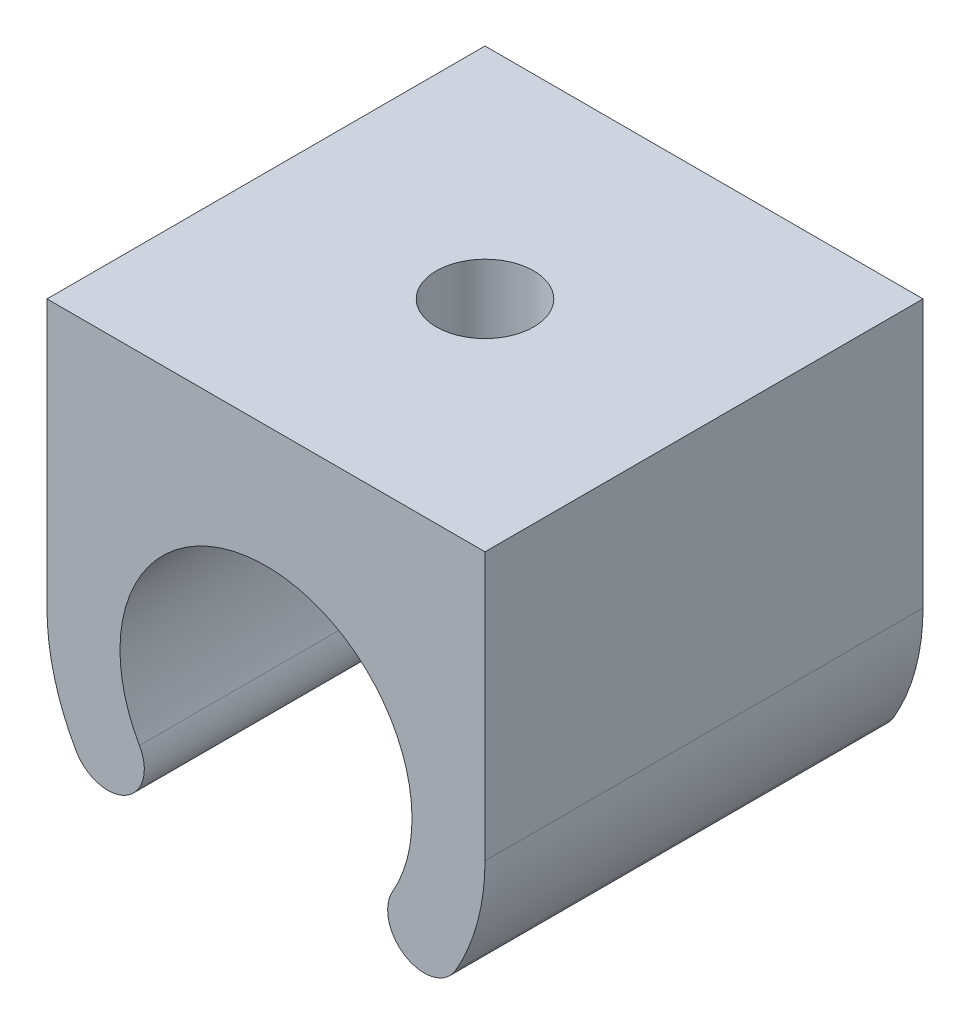
ISO-10303-21;
HEADER;
FILE_DESCRIPTION(('STEP AP214'),'2;1');
FILE_NAME('part.step','',(''),(''),'','','');
FILE_SCHEMA(('AUTOMOTIVE_DESIGN { 1 0 10303 214 1 1 1 1 }'));
ENDSEC;
DATA;
#1=APPLICATION_CONTEXT('core data for automotive mechanical design processes');
#2=APPLICATION_PROTOCOL_DEFINITION('international standard','automotive_design',2000,#1);
#3=PRODUCT_CONTEXT('',#1,'mechanical');
#4=PRODUCT('Part','Part','',(#3));
#5=PRODUCT_RELATED_PRODUCT_CATEGORY('part','',(#4));
#6=PRODUCT_DEFINITION_FORMATION('','',#4);
#7=PRODUCT_DEFINITION_CONTEXT('part definition',#1,'design');
#8=PRODUCT_DEFINITION('design','',#6,#7);
#9=PRODUCT_DEFINITION_SHAPE('','',#8);
#10=(LENGTH_UNIT() NAMED_UNIT(*) SI_UNIT(.MILLI.,.METRE.));
#11=(NAMED_UNIT(*) PLANE_ANGLE_UNIT() SI_UNIT($,.RADIAN.));
#12=(NAMED_UNIT(*) SI_UNIT($,.STERADIAN.) SOLID_ANGLE_UNIT());
#13=UNCERTAINTY_MEASURE_WITH_UNIT(LENGTH_MEASURE(1.E-05),#10,'distance_accuracy_value','');
#14=(GEOMETRIC_REPRESENTATION_CONTEXT(3) GLOBAL_UNCERTAINTY_ASSIGNED_CONTEXT((#13)) GLOBAL_UNIT_ASSIGNED_CONTEXT((#10,
#11,#12)) REPRESENTATION_CONTEXT('',''));
#15=CARTESIAN_POINT('',(0.,0.,0.));
#16=DIRECTION('',(0.,0.,1.));
#17=DIRECTION('',(1.,0.,0.));
#18=AXIS2_PLACEMENT_3D('',#15,#16,#17);
#19=CARTESIAN_POINT('',(-4.5,0.,4.5));
#20=DIRECTION('',(1.,0.,0.));
#21=DIRECTION('',(0.,0.,-1.));
#22=AXIS2_PLACEMENT_3D('',#19,#20,#21);
#23=PLANE('',#22);
#24=DIRECTION('',(0.,-1.,0.));
#25=VECTOR('',#24,1.);
#26=CARTESIAN_POINT('',(-4.5,0.,-4.5));
#27=LINE('',#26,#25);
#28=CARTESIAN_POINT('',(-4.5,5.5,-4.5));
#29=VERTEX_POINT('',#28);
#30=CARTESIAN_POINT('',(-4.5,0.,-4.5));
#31=VERTEX_POINT('',#30);
#32=EDGE_CURVE('E129',#29,#31,#27,.T.);
#33=ORIENTED_EDGE('',*,*,#32,.T.);
#34=DIRECTION('',(0.,0.,-1.));
#35=VECTOR('',#34,1.);
#36=CARTESIAN_POINT('',(-4.5,0.,4.5));
#37=LINE('',#36,#35);
#38=CARTESIAN_POINT('',(-4.5,0.,4.5));
#39=VERTEX_POINT('',#38);
#40=EDGE_CURVE('E11',#39,#31,#37,.T.);
#41=ORIENTED_EDGE('',*,*,#40,.F.);
#42=DIRECTION('',(0.,-1.,0.));
#43=VECTOR('',#42,1.);
#44=CARTESIAN_POINT('',(-4.5,0.,4.5));
#45=LINE('',#44,#43);
#46=CARTESIAN_POINT('',(-4.5,5.5,4.5));
#47=VERTEX_POINT('',#46);
#48=EDGE_CURVE('E144',#47,#39,#45,.T.);
#49=ORIENTED_EDGE('',*,*,#48,.F.);
#50=DIRECTION('',(0.,0.,-1.));
#51=VECTOR('',#50,1.);
#52=CARTESIAN_POINT('',(-4.5,5.5,4.5));
#53=LINE('',#52,#51);
#54=EDGE_CURVE('E125',#47,#29,#53,.T.);
#55=ORIENTED_EDGE('',*,*,#54,.T.);
#56=EDGE_LOOP('',(#33,#41,#49,#55));
#57=FACE_BOUND('',#56,.T.);
#58=ADVANCED_FACE('F33',(#57),#23,.F.);
#59=CARTESIAN_POINT('',(0.,0.,4.5));
#60=DIRECTION('',(0.,0.,-1.));
#61=DIRECTION('',(-1.,0.,0.));
#62=AXIS2_PLACEMENT_3D('',#59,#60,#61);
#63=CYLINDRICAL_SURFACE('',#62,4.5);
#64=CARTESIAN_POINT('',(0.,0.,-4.5));
#65=DIRECTION('',(0.,0.,1.));
#66=DIRECTION('',(-1.,0.,0.));
#67=AXIS2_PLACEMENT_3D('',#64,#65,#66);
#68=CIRCLE('',#67,4.5);
#69=CARTESIAN_POINT('',(-3.9,-2.24499443206436,-4.5));
#70=VERTEX_POINT('',#69);
#71=EDGE_CURVE('E132',#31,#70,#68,.T.);
#72=ORIENTED_EDGE('',*,*,#71,.T.);
#73=DIRECTION('',(0.,0.,-1.));
#74=VECTOR('',#73,1.);
#75=CARTESIAN_POINT('',(-3.9,-2.24499443206436,4.5));
#76=LINE('',#75,#74);
#77=CARTESIAN_POINT('',(-3.9,-2.24499443206436,4.5));
#78=VERTEX_POINT('',#77);
#79=EDGE_CURVE('E41',#78,#70,#76,.T.);
#80=ORIENTED_EDGE('',*,*,#79,.F.);
#81=CARTESIAN_POINT('',(0.,0.,4.5));
#82=DIRECTION('',(0.,0.,1.));
#83=DIRECTION('',(-1.,0.,0.));
#84=AXIS2_PLACEMENT_3D('',#81,#82,#83);
#85=CIRCLE('',#84,4.5);
#86=EDGE_CURVE('E92',#39,#78,#85,.T.);
#87=ORIENTED_EDGE('',*,*,#86,.F.);
#88=ORIENTED_EDGE('',*,*,#40,.T.);
#89=EDGE_LOOP('',(#72,#80,#87,#88));
#90=FACE_BOUND('',#89,.T.);
#91=ADVANCED_FACE('F208',(#90),#63,.T.);
#92=CARTESIAN_POINT('',(-3.25,-1.87082869338697,4.5));
#93=DIRECTION('',(0.,0.,-1.));
#94=DIRECTION('',(-1.,0.,0.));
#95=AXIS2_PLACEMENT_3D('',#92,#93,#94);
#96=CYLINDRICAL_SURFACE('',#95,0.75);
#97=CARTESIAN_POINT('',(-3.25,-1.87082869338697,-4.5));
#98=DIRECTION('',(0.,0.,1.));
#99=DIRECTION('',(1.,0.,0.));
#100=AXIS2_PLACEMENT_3D('',#97,#98,#99);
#101=CIRCLE('',#100,0.75);
#102=CARTESIAN_POINT('',(-2.6,-1.49666295470958,-4.5));
#103=VERTEX_POINT('',#102);
#104=EDGE_CURVE('E135',#70,#103,#101,.T.);
#105=ORIENTED_EDGE('',*,*,#104,.T.);
#106=DIRECTION('',(0.,0.,-1.));
#107=VECTOR('',#106,1.);
#108=CARTESIAN_POINT('',(-2.6,-1.49666295470958,4.5));
#109=LINE('',#108,#107);
#110=CARTESIAN_POINT('',(-2.6,-1.49666295470958,4.5));
#111=VERTEX_POINT('',#110);
#112=EDGE_CURVE('E151',#111,#103,#109,.T.);
#113=ORIENTED_EDGE('',*,*,#112,.F.);
#114=CARTESIAN_POINT('',(-3.25,-1.87082869338697,4.5));
#115=DIRECTION('',(0.,0.,1.));
#116=DIRECTION('',(1.,0.,0.));
#117=AXIS2_PLACEMENT_3D('',#114,#115,#116);
#118=CIRCLE('',#117,0.75);
#119=EDGE_CURVE('E159',#78,#111,#118,.T.);
#120=ORIENTED_EDGE('',*,*,#119,.F.);
#121=ORIENTED_EDGE('',*,*,#79,.T.);
#122=EDGE_LOOP('',(#105,#113,#120,#121));
#123=FACE_BOUND('',#122,.T.);
#124=ADVANCED_FACE('F157',(#123),#96,.T.);
#125=CARTESIAN_POINT('',(0.,0.,4.5));
#126=DIRECTION('',(0.,0.,-1.));
#127=DIRECTION('',(-1.,0.,0.));
#128=AXIS2_PLACEMENT_3D('',#125,#126,#127);
#129=CYLINDRICAL_SURFACE('',#128,3.);
#130=CARTESIAN_POINT('',(0.,3.,1.));
#131=CARTESIAN_POINT('',(-0.0545633628867233,3.00000015300943,1.00000025373164));
#132=CARTESIAN_POINT('',(-0.10912519453855,2.99849769507545,0.995519733872783));
#133=CARTESIAN_POINT('',(-0.216641760872972,2.99265210203281,0.977770891182781));
#134=CARTESIAN_POINT('',(-0.269596328118818,2.98830867202153,0.964501656051078));
#135=CARTESIAN_POINT('',(-0.372332789501776,2.97725307906443,0.929680756615952));
#136=CARTESIAN_POINT('',(-0.422119825886034,2.97054487730853,0.908142937540728));
#137=CARTESIAN_POINT('',(-0.517374936805325,2.95544445717342,0.857458827161653));
#138=CARTESIAN_POINT('',(-0.562842156958706,2.94705190667778,0.828311034997399));
#139=CARTESIAN_POINT('',(-0.649741675022266,2.92914094443005,0.762174195141247));
#140=CARTESIAN_POINT('',(-0.691003700298309,2.91959556463785,0.724968765739507));
#141=CARTESIAN_POINT('',(-0.766832692702084,2.90060314783121,0.644232845293434));
#142=CARTESIAN_POINT('',(-0.801398185489462,2.89115613290549,0.600700965071487));
#143=CARTESIAN_POINT('',(-0.863824942227859,2.87313332477274,0.50701488480354));
#144=CARTESIAN_POINT('',(-0.891464858221032,2.86459039275688,0.456706260267877));
#145=CARTESIAN_POINT('',(-0.937818873877721,2.84975305418601,0.351823905541453));
#146=CARTESIAN_POINT('',(-0.956535697386765,2.84345796160746,0.297251482837256));
#147=CARTESIAN_POINT('',(-0.983873461509163,2.83411303269377,0.18732677850329));
#148=CARTESIAN_POINT('',(-0.992813448271769,2.83096095769611,0.132062791510936));
#149=CARTESIAN_POINT('',(-1.00134112333448,2.82795656629507,0.0207362458441192));
#150=CARTESIAN_POINT('',(-1.00093170160472,2.8281032302273,-0.0353260607091904));
#151=CARTESIAN_POINT('',(-0.991019903703419,2.8315901500818,-0.143936630444021));
#152=CARTESIAN_POINT('',(-0.981933913166995,2.83478415867533,-0.196528402919019));
#153=CARTESIAN_POINT('',(-0.955606162849417,2.84376657724551,-0.299393419606834));
#154=CARTESIAN_POINT('',(-0.938363426591871,2.84955529784108,-0.34966638543507));
#155=CARTESIAN_POINT('',(-0.895939058060211,2.86317911131249,-0.447412749591479));
#156=CARTESIAN_POINT('',(-0.870634048707263,2.87104565793117,-0.494828025469526));
#157=CARTESIAN_POINT('',(-0.812889106303139,2.88792558575726,-0.584870908279727));
#158=CARTESIAN_POINT('',(-0.780447112364005,2.89693929790464,-0.627497126933381));
#159=CARTESIAN_POINT('',(-0.707349332682238,2.91567329167741,-0.709091598160772));
#160=CARTESIAN_POINT('',(-0.666353150076312,2.92540589354843,-0.747752694509069));
#161=CARTESIAN_POINT('',(-0.578339569970064,2.94406938387037,-0.817731266663397));
#162=CARTESIAN_POINT('',(-0.531321595660815,2.95300019538067,-0.849048038164495));
#163=CARTESIAN_POINT('',(-0.431947613046268,2.96917107937794,-0.903696300235068));
#164=CARTESIAN_POINT('',(-0.379543276416337,2.97639350008039,-0.926945491340732));
#165=CARTESIAN_POINT('',(-0.271269083364508,2.98820567144435,-0.964203173955711));
#166=CARTESIAN_POINT('',(-0.215400438154954,2.99279633654878,-0.978214875423438));
#167=CARTESIAN_POINT('',(-0.104383829529304,2.99867627071441,-0.996055666022358));
#168=CARTESIAN_POINT('',(-0.0493095998648453,3.00010001833731,-1.00029980917275));
#169=CARTESIAN_POINT('',(0.0607750699602364,2.99988902694825,-0.999667326401533));
#170=CARTESIAN_POINT('',(0.115785519319647,2.99825480419352,-0.994792240020132));
#171=CARTESIAN_POINT('',(0.222519866304259,2.99220024717114,-0.976388092264033));
#172=CARTESIAN_POINT('',(0.274292806834856,2.98786198711228,-0.963113793950476));
#173=CARTESIAN_POINT('',(0.374855958579561,2.97691846830034,-0.928606555533302));
#174=CARTESIAN_POINT('',(0.423645788508559,2.97031292046541,-0.907372600532325));
#175=CARTESIAN_POINT('',(0.518288296393321,2.95528931287427,-0.8569295681591));
#176=CARTESIAN_POINT('',(0.564029959217329,2.94682814756305,-0.827525406716401));
#177=CARTESIAN_POINT('',(0.650064830135404,2.92905253915743,-0.761805849986946));
#178=CARTESIAN_POINT('',(0.690356367794894,2.91973783591888,-0.725488343969838));
#179=CARTESIAN_POINT('',(0.766252507807013,2.90076847982472,-0.645021248991736));
#180=CARTESIAN_POINT('',(0.801560969248491,2.89111761095155,-0.600590773066752));
#181=CARTESIAN_POINT('',(0.864257522320854,2.87299973286981,-0.5062284321955));
#182=CARTESIAN_POINT('',(0.891645547920843,2.8645327335312,-0.456296521389798));
#183=CARTESIAN_POINT('',(0.93759693042336,2.84982391820308,-0.352326984693406));
#184=CARTESIAN_POINT('',(0.956178132197766,2.84357760900632,-0.298297920757221));
#185=CARTESIAN_POINT('',(0.983894666792163,2.83410832399133,-0.187621349875851));
#186=CARTESIAN_POINT('',(0.993034254961243,2.83088398622698,-0.130975034566937));
#187=CARTESIAN_POINT('',(1.00127628247038,2.82797858875071,-0.0198029039867893));
#188=CARTESIAN_POINT('',(1.00087025731093,2.82812400344299,0.0346823402517368));
#189=CARTESIAN_POINT('',(0.991242293454878,2.8315126992356,0.142765074899743));
#190=CARTESIAN_POINT('',(0.982020879458887,2.83475579595884,0.19636261795291));
#191=CARTESIAN_POINT('',(0.95537181312698,2.84384524278943,0.300135663012667));
#192=CARTESIAN_POINT('',(0.93810334601488,2.84964098015514,0.350356825007232));
#193=CARTESIAN_POINT('',(0.895979365760382,2.86316398825434,0.447227406935532));
#194=CARTESIAN_POINT('',(0.871122168553979,2.87089168765297,0.493876031187259));
#195=CARTESIAN_POINT('',(0.813260692583249,2.8878282922406,0.584483669923692));
#196=CARTESIAN_POINT('',(0.779948242764532,2.89708711641604,0.628236501898595));
#197=CARTESIAN_POINT('',(0.706642883135697,2.91583356283786,0.709689813383991));
#198=CARTESIAN_POINT('',(0.666648084451495,2.92532124912518,0.747388575688018));
#199=CARTESIAN_POINT('',(0.579241556920674,2.94390030525393,0.817144412289238));
#200=CARTESIAN_POINT('',(0.531601513499725,2.95296181801216,0.848924347751015));
#201=CARTESIAN_POINT('',(0.431357357406629,2.96925991172652,0.903990428850631));
#202=CARTESIAN_POINT('',(0.37875451813235,2.9764969590794,0.927278745922038));
#203=CARTESIAN_POINT('',(0.272493647200975,2.98805515068532,0.963721632488676));
#204=CARTESIAN_POINT('',(0.218987757676409,2.9924921242252,0.977282466263377));
#205=CARTESIAN_POINT('',(0.110320416010247,2.99846407064225,0.995420280677125));
#206=CARTESIAN_POINT('',(0.0551594255687465,2.99999984531906,0.999999743496537));
#207=CARTESIAN_POINT('',(0.,3.,1.));
#208=B_SPLINE_CURVE_WITH_KNOTS('',3,(#130,#131,#132,#133,#134,#135,#136,#137,#138,#139,#140,
#141,#142,#143,#144,#145,#146,#147,#148,#149,#150,#151,#152,#153,#154,#155,#156,#157,#158,#159,
#160,#161,#162,#163,#164,#165,#166,#167,#168,#169,#170,#171,#172,#173,#174,#175,#176,#177,#178,
#179,#180,#181,#182,#183,#184,#185,#186,#187,#188,#189,#190,#191,#192,#193,#194,#195,#196,#197,
#198,#199,#200,#201,#202,#203,#204,#205,#206,#207),.UNSPECIFIED.,.T.,.F.,(4,2,2,2,2,2,2,2,2,2,2,
2,2,2,2,2,2,2,2,2,2,2,2,2,2,2,2,2,2,2,2,2,2,2,2,2,2,2,4),(0.,0.163487106026011,
0.326991185267521,0.490222672870274,0.6534863777991,0.82184684282756,0.990244332875303,
1.1634838482347,1.33667044692833,1.5040192574184,1.67131633987485,1.8309682655128,
1.99063930855482,2.15288171155131,2.31517102558207,2.48593305811367,2.65671145966618,
2.82918405650357,3.00159668877208,3.1665358317517,3.33144713164177,3.49158157978213,
3.65173645284104,3.81610399843736,3.98052180821891,4.15241022880752,4.32430008234997,
4.49584013824416,4.66730284700846,4.82995666056619,4.99260079341185,5.15215587070228,
5.31174638165788,5.47830066681615,5.64490211113589,5.8179966082491,5.99104681142266,
6.15636558363624,6.3216386602795),.UNSPECIFIED.);
#209=CARTESIAN_POINT('',(0.,3.,1.));
#210=VERTEX_POINT('',#209);
#211=EDGE_CURVE('E133',#210,#210,#208,.T.);
#212=ORIENTED_EDGE('',*,*,#211,.F.);
#213=EDGE_LOOP('',(#212));
#214=FACE_BOUND('',#213,.T.);
#215=CARTESIAN_POINT('',(0.,0.,-4.5));
#216=DIRECTION('',(0.,0.,-1.));
#217=DIRECTION('',(1.,0.,0.));
#218=AXIS2_PLACEMENT_3D('',#215,#216,#217);
#219=CIRCLE('',#218,3.);
#220=CARTESIAN_POINT('',(2.6,-1.49666295470958,-4.5));
#221=VERTEX_POINT('',#220);
#222=EDGE_CURVE('E137',#103,#221,#219,.T.);
#223=ORIENTED_EDGE('',*,*,#222,.T.);
#224=DIRECTION('',(0.,0.,-1.));
#225=VECTOR('',#224,1.);
#226=CARTESIAN_POINT('',(2.6,-1.49666295470958,4.5));
#227=LINE('',#226,#225);
#228=CARTESIAN_POINT('',(2.6,-1.49666295470958,4.5));
#229=VERTEX_POINT('',#228);
#230=EDGE_CURVE('E148',#229,#221,#227,.T.);
#231=ORIENTED_EDGE('',*,*,#230,.F.);
#232=CARTESIAN_POINT('',(0.,0.,4.5));
#233=DIRECTION('',(0.,0.,-1.));
#234=DIRECTION('',(1.,0.,0.));
#235=AXIS2_PLACEMENT_3D('',#232,#233,#234);
#236=CIRCLE('',#235,3.);
#237=EDGE_CURVE('E171',#111,#229,#236,.T.);
#238=ORIENTED_EDGE('',*,*,#237,.F.);
#239=ORIENTED_EDGE('',*,*,#112,.T.);
#240=EDGE_LOOP('',(#223,#231,#238,#239));
#241=FACE_BOUND('',#240,.T.);
#242=ADVANCED_FACE('F167',(#214,#241),#129,.F.);
#243=CARTESIAN_POINT('',(3.25,-1.87082869338697,4.5));
#244=DIRECTION('',(0.,0.,-1.));
#245=DIRECTION('',(-1.,0.,0.));
#246=AXIS2_PLACEMENT_3D('',#243,#244,#245);
#247=CYLINDRICAL_SURFACE('',#246,0.75);
#248=CARTESIAN_POINT('',(3.25,-1.87082869338697,-4.5));
#249=DIRECTION('',(0.,0.,1.));
#250=DIRECTION('',(1.,0.,0.));
#251=AXIS2_PLACEMENT_3D('',#248,#249,#250);
#252=CIRCLE('',#251,0.75);
#253=CARTESIAN_POINT('',(3.9,-2.24499443206436,-4.5));
#254=VERTEX_POINT('',#253);
#255=EDGE_CURVE('E139',#221,#254,#252,.T.);
#256=ORIENTED_EDGE('',*,*,#255,.T.);
#257=DIRECTION('',(0.,0.,-1.));
#258=VECTOR('',#257,1.);
#259=CARTESIAN_POINT('',(3.9,-2.24499443206436,4.5));
#260=LINE('',#259,#258);
#261=CARTESIAN_POINT('',(3.9,-2.24499443206436,4.5));
#262=VERTEX_POINT('',#261);
#263=EDGE_CURVE('E120',#262,#254,#260,.T.);
#264=ORIENTED_EDGE('',*,*,#263,.F.);
#265=CARTESIAN_POINT('',(3.25,-1.87082869338697,4.5));
#266=DIRECTION('',(0.,0.,1.));
#267=DIRECTION('',(1.,0.,0.));
#268=AXIS2_PLACEMENT_3D('',#265,#266,#267);
#269=CIRCLE('',#268,0.75);
#270=EDGE_CURVE('E111',#229,#262,#269,.T.);
#271=ORIENTED_EDGE('',*,*,#270,.F.);
#272=ORIENTED_EDGE('',*,*,#230,.T.);
#273=EDGE_LOOP('',(#256,#264,#271,#272));
#274=FACE_BOUND('',#273,.T.);
#275=ADVANCED_FACE('F170',(#274),#247,.T.);
#276=CARTESIAN_POINT('',(0.,0.,4.5));
#277=DIRECTION('',(0.,0.,-1.));
#278=DIRECTION('',(-1.,0.,0.));
#279=AXIS2_PLACEMENT_3D('',#276,#277,#278);
#280=CYLINDRICAL_SURFACE('',#279,4.5);
#281=CARTESIAN_POINT('',(0.,0.,-4.5));
#282=DIRECTION('',(0.,0.,1.));
#283=DIRECTION('',(-1.,0.,0.));
#284=AXIS2_PLACEMENT_3D('',#281,#282,#283);
#285=CIRCLE('',#284,4.5);
#286=CARTESIAN_POINT('',(4.5,0.,-4.5));
#287=VERTEX_POINT('',#286);
#288=EDGE_CURVE('E119',#254,#287,#285,.T.);
#289=ORIENTED_EDGE('',*,*,#288,.T.);
#290=DIRECTION('',(0.,0.,-1.));
#291=VECTOR('',#290,1.);
#292=CARTESIAN_POINT('',(4.5,0.,4.5));
#293=LINE('',#292,#291);
#294=CARTESIAN_POINT('',(4.5,0.,4.5));
#295=VERTEX_POINT('',#294);
#296=EDGE_CURVE('E116',#295,#287,#293,.T.);
#297=ORIENTED_EDGE('',*,*,#296,.F.);
#298=CARTESIAN_POINT('',(0.,0.,4.5));
#299=DIRECTION('',(0.,0.,1.));
#300=DIRECTION('',(-1.,0.,0.));
#301=AXIS2_PLACEMENT_3D('',#298,#299,#300);
#302=CIRCLE('',#301,4.5);
#303=EDGE_CURVE('E105',#262,#295,#302,.T.);
#304=ORIENTED_EDGE('',*,*,#303,.F.);
#305=ORIENTED_EDGE('',*,*,#263,.T.);
#306=EDGE_LOOP('',(#289,#297,#304,#305));
#307=FACE_BOUND('',#306,.T.);
#308=ADVANCED_FACE('F117',(#307),#280,.T.);
#309=CARTESIAN_POINT('',(4.5,5.5,4.5));
#310=DIRECTION('',(-1.,0.,0.));
#311=DIRECTION('',(0.,0.,1.));
#312=AXIS2_PLACEMENT_3D('',#309,#310,#311);
#313=PLANE('',#312);
#314=DIRECTION('',(0.,1.,0.));
#315=VECTOR('',#314,1.);
#316=CARTESIAN_POINT('',(4.5,5.5,-4.5));
#317=LINE('',#316,#315);
#318=CARTESIAN_POINT('',(4.5,5.5,-4.5));
#319=VERTEX_POINT('',#318);
#320=EDGE_CURVE('E78',#287,#319,#317,.T.);
#321=ORIENTED_EDGE('',*,*,#320,.T.);
#322=DIRECTION('',(0.,0.,-1.));
#323=VECTOR('',#322,1.);
#324=CARTESIAN_POINT('',(4.5,5.5,4.5));
#325=LINE('',#324,#323);
#326=CARTESIAN_POINT('',(4.5,5.5,4.5));
#327=VERTEX_POINT('',#326);
#328=EDGE_CURVE('E121',#327,#319,#325,.T.);
#329=ORIENTED_EDGE('',*,*,#328,.F.);
#330=DIRECTION('',(0.,1.,0.));
#331=VECTOR('',#330,1.);
#332=CARTESIAN_POINT('',(4.5,5.5,4.5));
#333=LINE('',#332,#331);
#334=EDGE_CURVE('E109',#295,#327,#333,.T.);
#335=ORIENTED_EDGE('',*,*,#334,.F.);
#336=ORIENTED_EDGE('',*,*,#296,.T.);
#337=EDGE_LOOP('',(#321,#329,#335,#336));
#338=FACE_BOUND('',#337,.T.);
#339=ADVANCED_FACE('F123',(#338),#313,.F.);
#340=CARTESIAN_POINT('',(-4.5,5.5,4.5));
#341=DIRECTION('',(0.,-1.,0.));
#342=DIRECTION('',(0.,0.,-1.));
#343=AXIS2_PLACEMENT_3D('',#340,#341,#342);
#344=PLANE('',#343);
#345=CARTESIAN_POINT('',(0.,5.5,0.));
#346=DIRECTION('',(0.,1.,0.));
#347=DIRECTION('',(0.,0.,1.));
#348=AXIS2_PLACEMENT_3D('',#345,#346,#347);
#349=CIRCLE('',#348,1.);
#350=CARTESIAN_POINT('',(0.,5.5,1.));
#351=VERTEX_POINT('',#350);
#352=EDGE_CURVE('E183',#351,#351,#349,.T.);
#353=ORIENTED_EDGE('',*,*,#352,.F.);
#354=EDGE_LOOP('',(#353));
#355=FACE_BOUND('',#354,.T.);
#356=DIRECTION('',(-1.,0.,0.));
#357=VECTOR('',#356,1.);
#358=CARTESIAN_POINT('',(-4.5,5.5,-4.5));
#359=LINE('',#358,#357);
#360=EDGE_CURVE('E84',#319,#29,#359,.T.);
#361=ORIENTED_EDGE('',*,*,#360,.T.);
#362=ORIENTED_EDGE('',*,*,#54,.F.);
#363=DIRECTION('',(-1.,0.,0.));
#364=VECTOR('',#363,1.);
#365=CARTESIAN_POINT('',(-4.5,5.5,4.5));
#366=LINE('',#365,#364);
#367=EDGE_CURVE('E49',#327,#47,#366,.T.);
#368=ORIENTED_EDGE('',*,*,#367,.F.);
#369=ORIENTED_EDGE('',*,*,#328,.T.);
#370=EDGE_LOOP('',(#361,#362,#368,#369));
#371=FACE_BOUND('',#370,.T.);
#372=ADVANCED_FACE('F192',(#355,#371),#344,.F.);
#373=CARTESIAN_POINT('',(0.,0.,4.5));
#374=DIRECTION('',(0.,0.,-1.));
#375=DIRECTION('',(-1.,0.,0.));
#376=AXIS2_PLACEMENT_3D('',#373,#374,#375);
#377=PLANE('',#376);
#378=ORIENTED_EDGE('',*,*,#48,.T.);
#379=ORIENTED_EDGE('',*,*,#86,.T.);
#380=ORIENTED_EDGE('',*,*,#119,.T.);
#381=ORIENTED_EDGE('',*,*,#237,.T.);
#382=ORIENTED_EDGE('',*,*,#270,.T.);
#383=ORIENTED_EDGE('',*,*,#303,.T.);
#384=ORIENTED_EDGE('',*,*,#334,.T.);
#385=ORIENTED_EDGE('',*,*,#367,.T.);
#386=EDGE_LOOP('',(#378,#379,#380,#381,#382,#383,#384,#385));
#387=FACE_BOUND('',#386,.T.);
#388=ADVANCED_FACE('F107',(#387),#377,.F.);
#389=CARTESIAN_POINT('',(0.,0.,-4.5));
#390=DIRECTION('',(0.,0.,-1.));
#391=DIRECTION('',(-1.,0.,0.));
#392=AXIS2_PLACEMENT_3D('',#389,#390,#391);
#393=PLANE('',#392);
#394=ORIENTED_EDGE('',*,*,#32,.F.);
#395=ORIENTED_EDGE('',*,*,#360,.F.);
#396=ORIENTED_EDGE('',*,*,#320,.F.);
#397=ORIENTED_EDGE('',*,*,#288,.F.);
#398=ORIENTED_EDGE('',*,*,#255,.F.);
#399=ORIENTED_EDGE('',*,*,#222,.F.);
#400=ORIENTED_EDGE('',*,*,#104,.F.);
#401=ORIENTED_EDGE('',*,*,#71,.F.);
#402=EDGE_LOOP('',(#394,#395,#396,#397,#398,#399,#400,#401));
#403=FACE_BOUND('',#402,.T.);
#404=ADVANCED_FACE('F163',(#403),#393,.T.);
#405=CARTESIAN_POINT('',(0.,-2.62182869338697,0.));
#406=DIRECTION('',(0.,1.,0.));
#407=DIRECTION('',(0.,0.,1.));
#408=AXIS2_PLACEMENT_3D('',#405,#406,#407);
#409=CYLINDRICAL_SURFACE('',#408,1.);
#410=ORIENTED_EDGE('',*,*,#352,.T.);
#411=EDGE_LOOP('',(#410));
#412=FACE_BOUND('',#411,.T.);
#413=ORIENTED_EDGE('',*,*,#211,.T.);
#414=EDGE_LOOP('',(#413));
#415=FACE_BOUND('',#414,.T.);
#416=ADVANCED_FACE('F184',(#412,#415),#409,.F.);
#417=CLOSED_SHELL('',(#58,#91,#124,#242,#275,#308,#339,#372,#388,#404,#416));
#418=MANIFOLD_SOLID_BREP('B2',#417);
#419=ADVANCED_BREP_SHAPE_REPRESENTATION('',(#18,#418),#14);
#420=SHAPE_DEFINITION_REPRESENTATION(#9,#419);
ENDSEC;
END-ISO-10303-21;
